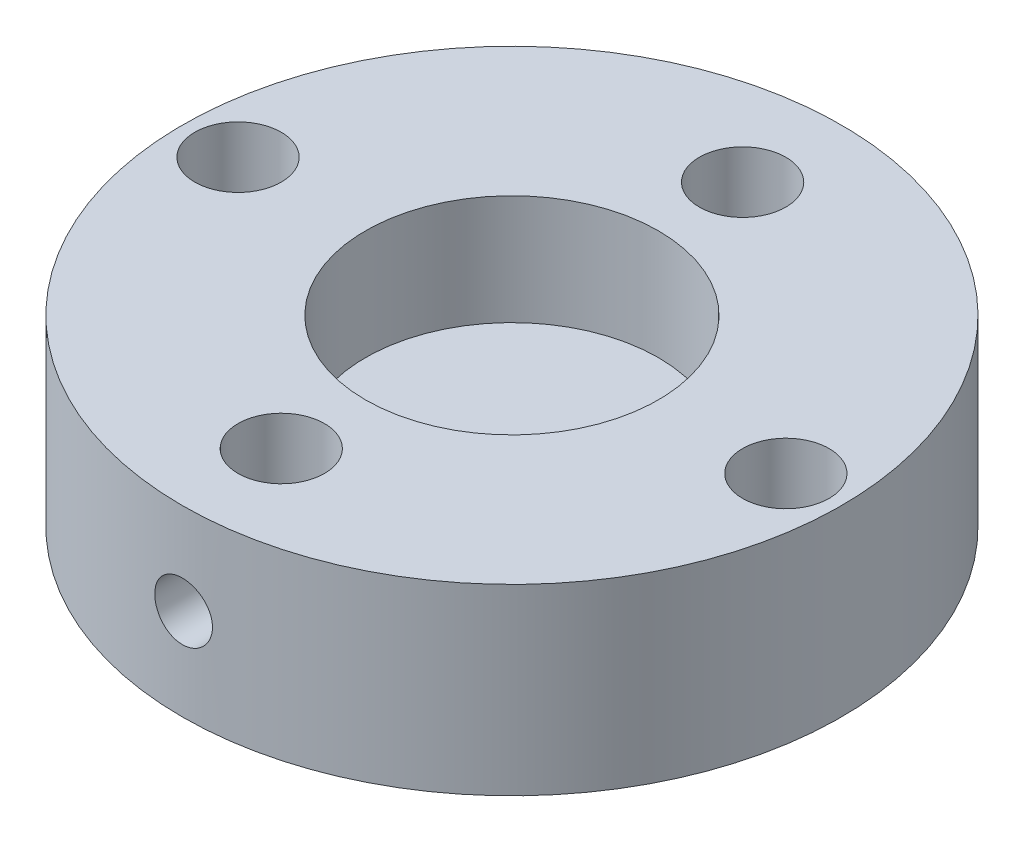
ISO-10303-21;
HEADER;
FILE_DESCRIPTION(('STEP AP214'),'2;1');
FILE_NAME('part.step','',(''),(''),'','','');
FILE_SCHEMA(('AUTOMOTIVE_DESIGN { 1 0 10303 214 1 1 1 1 }'));
ENDSEC;
DATA;
#1=APPLICATION_CONTEXT('core data for automotive mechanical design processes');
#2=APPLICATION_PROTOCOL_DEFINITION('international standard','automotive_design',2000,#1);
#3=PRODUCT_CONTEXT('',#1,'mechanical');
#4=PRODUCT('Part','Part','',(#3));
#5=PRODUCT_RELATED_PRODUCT_CATEGORY('part','',(#4));
#6=PRODUCT_DEFINITION_FORMATION('','',#4);
#7=PRODUCT_DEFINITION_CONTEXT('part definition',#1,'design');
#8=PRODUCT_DEFINITION('design','',#6,#7);
#9=PRODUCT_DEFINITION_SHAPE('','',#8);
#10=(LENGTH_UNIT() NAMED_UNIT(*) SI_UNIT(.MILLI.,.METRE.));
#11=(NAMED_UNIT(*) PLANE_ANGLE_UNIT() SI_UNIT($,.RADIAN.));
#12=(NAMED_UNIT(*) SI_UNIT($,.STERADIAN.) SOLID_ANGLE_UNIT());
#13=UNCERTAINTY_MEASURE_WITH_UNIT(LENGTH_MEASURE(1.E-05),#10,'distance_accuracy_value','');
#14=(GEOMETRIC_REPRESENTATION_CONTEXT(3) GLOBAL_UNCERTAINTY_ASSIGNED_CONTEXT((#13)) GLOBAL_UNIT_ASSIGNED_CONTEXT((#10,
#11,#12)) REPRESENTATION_CONTEXT('',''));
#15=CARTESIAN_POINT('',(0.,0.,0.));
#16=DIRECTION('',(0.,0.,1.));
#17=DIRECTION('',(1.,0.,0.));
#18=AXIS2_PLACEMENT_3D('',#15,#16,#17);
#19=CARTESIAN_POINT('',(0.,6.35,0.));
#20=DIRECTION('',(0.,-1.,0.));
#21=DIRECTION('',(0.,0.,-1.));
#22=AXIS2_PLACEMENT_3D('',#19,#20,#21);
#23=CYLINDRICAL_SURFACE('',#22,11.43);
#24=CARTESIAN_POINT('',(1.,3.175,11.3861714373182));
#25=CARTESIAN_POINT('',(0.999997555838026,3.11894500843291,11.3861720165734));
#26=CARTESIAN_POINT('',(0.995270896386772,3.0628521103578,11.3865898393277));
#27=CARTESIAN_POINT('',(0.976485350327271,2.95221906891785,11.3882159189293));
#28=CARTESIAN_POINT('',(0.962415956830822,2.89768074593707,11.3894250656817));
#29=CARTESIAN_POINT('',(0.92535561340541,2.79177515931459,11.3924958037464));
#30=CARTESIAN_POINT('',(0.902369802818164,2.74040608867789,11.3943570191527));
#31=CARTESIAN_POINT('',(0.848138425403111,2.64226721220982,11.3985217140138));
#32=CARTESIAN_POINT('',(0.816894595213187,2.5954964422029,11.4008251004536));
#33=CARTESIAN_POINT('',(0.746939179515819,2.50773816539562,11.4056218809279));
#34=CARTESIAN_POINT('',(0.708209129929394,2.46676540081199,11.4081157353402));
#35=CARTESIAN_POINT('',(0.624419857178876,2.3918929271586,11.4130082506768));
#36=CARTESIAN_POINT('',(0.579360354646559,2.35799353045608,11.4154069073931));
#37=CARTESIAN_POINT('',(0.484102656973631,2.29818049543833,11.4198431770178));
#38=CARTESIAN_POINT('',(0.433896371688904,2.2722796945228,11.4218802073271));
#39=CARTESIAN_POINT('',(0.329826648794757,2.22928119422985,11.4253587319567));
#40=CARTESIAN_POINT('',(0.275963281047933,2.21218332674027,11.4268002376499));
#41=CARTESIAN_POINT('',(0.16625575701746,2.1873187000481,11.4289220731964));
#42=CARTESIAN_POINT('',(0.110417068666835,2.17952798464206,11.429604356942));
#43=CARTESIAN_POINT('',(-0.00177924398146985,2.17342473923944,11.430137501248));
#44=CARTESIAN_POINT('',(-0.0581368577202864,2.1751120168125,11.4299883786884));
#45=CARTESIAN_POINT('',(-0.169608754882562,2.18789730406455,11.4288771214472));
#46=CARTESIAN_POINT('',(-0.224726018230913,2.19896955285521,11.427917212326));
#47=CARTESIAN_POINT('',(-0.332316809154457,2.23017040839638,11.4252948877021));
#48=CARTESIAN_POINT('',(-0.384790309400042,2.2502991087456,11.423632464939));
#49=CARTESIAN_POINT('',(-0.485685838763071,2.2990700902863,11.419788279077));
#50=CARTESIAN_POINT('',(-0.53410227871048,2.32772387664367,11.4176058149456));
#51=CARTESIAN_POINT('',(-0.625448323335066,2.39272330086099,11.412966722835));
#52=CARTESIAN_POINT('',(-0.668377805133158,2.42906911093354,11.4105100887182));
#53=CARTESIAN_POINT('',(-0.747682006089085,2.5085659766914,11.4055889348539));
#54=CARTESIAN_POINT('',(-0.784034284205354,2.55173942283603,11.40312441626));
#55=CARTESIAN_POINT('',(-0.848978711203027,2.64358808817524,11.3984735224765));
#56=CARTESIAN_POINT('',(-0.877570852696613,2.69226331260756,11.3962871475516));
#57=CARTESIAN_POINT('',(-0.926182699400104,2.79374992630512,11.3924397393145));
#58=CARTESIAN_POINT('',(-0.946201188515546,2.84656190107487,11.3907787805364));
#59=CARTESIAN_POINT('',(-0.977080599091123,2.95481512686844,11.3881717477558));
#60=CARTESIAN_POINT('',(-0.987941733057373,3.010256316847,11.387225657164));
#61=CARTESIAN_POINT('',(-1.00016961040494,3.12199768338941,11.3861582214213));
#62=CARTESIAN_POINT('',(-1.00156767148317,3.17829440795342,11.3860341558373));
#63=CARTESIAN_POINT('',(-0.994911802588876,3.29032139879284,11.3866176378213));
#64=CARTESIAN_POINT('',(-0.986857969935857,3.34605167089466,11.387325176827));
#65=CARTESIAN_POINT('',(-0.96155306264297,3.45527355077652,11.3894896675348));
#66=CARTESIAN_POINT('',(-0.944316648056771,3.50876858073464,11.3909454245716));
#67=CARTESIAN_POINT('',(-0.901150773376053,3.6121075418915,11.394441339764));
#68=CARTESIAN_POINT('',(-0.875221159819217,3.6619514086168,11.3964815082362));
#69=CARTESIAN_POINT('',(-0.815325871463008,3.75671633979027,11.400922965154));
#70=CARTESIAN_POINT('',(-0.78133935429241,3.8016241867347,11.4033251842162));
#71=CARTESIAN_POINT('',(-0.706325059451844,3.88510861831019,11.4082169511645));
#72=CARTESIAN_POINT('',(-0.665297148322542,3.92368508291204,11.4107065007051));
#73=CARTESIAN_POINT('',(-0.577229240080058,3.99351885952334,11.4155005466397));
#74=CARTESIAN_POINT('',(-0.530173060130384,4.02475580435066,11.4178045166883));
#75=CARTESIAN_POINT('',(-0.431464835370097,4.07888399844227,11.421960205372));
#76=CARTESIAN_POINT('',(-0.379812840510635,4.10177533839975,11.4238119289217));
#77=CARTESIAN_POINT('',(-0.273451738417607,4.1385276521858,11.4268520746027));
#78=CARTESIAN_POINT('',(-0.218746986937728,4.15240115240184,11.4280414164963));
#79=CARTESIAN_POINT('',(-0.107773679124563,4.17076489601897,11.4296265366183));
#80=CARTESIAN_POINT('',(-0.0515051557457677,4.17525533700431,11.4300223315569));
#81=CARTESIAN_POINT('',(0.0607978444524323,4.17472308302087,11.4299757804168));
#82=CARTESIAN_POINT('',(0.116832475450718,4.16973210029219,11.429536228297));
#83=CARTESIAN_POINT('',(0.227264346205335,4.15044489107848,11.4278738913439));
#84=CARTESIAN_POINT('',(0.28166158393109,4.13614865305424,11.4266511055393));
#85=CARTESIAN_POINT('',(0.387276035875597,4.09866498781539,11.4235594506122));
#86=CARTESIAN_POINT('',(0.438493484748339,4.07547821759005,11.4216906292313));
#87=CARTESIAN_POINT('',(0.536313999039591,4.02087523161488,11.4175158011809));
#88=CARTESIAN_POINT('',(0.582917126645287,3.98945912679256,11.4152098004045));
#89=CARTESIAN_POINT('',(0.670348501668957,3.91917017412494,11.410410132186));
#90=CARTESIAN_POINT('',(0.711157810745139,3.88027380849499,11.4079158883505));
#91=CARTESIAN_POINT('',(0.785685912597246,3.79617214511703,11.403025759686));
#92=CARTESIAN_POINT('',(0.819402989639507,3.75096532515119,11.4006298987701));
#93=CARTESIAN_POINT('',(0.878840174557921,3.65542956942002,11.3962025603864));
#94=CARTESIAN_POINT('',(0.904543939325216,3.60509044007583,11.394171831125));
#95=CARTESIAN_POINT('',(0.947101014090986,3.50082686918671,11.3907137508277));
#96=CARTESIAN_POINT('',(0.963964454751998,3.44690661169693,11.3892857095028));
#97=CARTESIAN_POINT('',(0.984088037137708,3.35639262056503,11.3875603077196));
#98=CARTESIAN_POINT('',(0.990047039870105,3.32038026111235,11.3870418914268));
#99=CARTESIAN_POINT('',(0.998003810348495,3.24791728112114,11.3863472683249));
#100=CARTESIAN_POINT('',(1.00000159005337,3.21146666190603,11.3861710604828));
#101=CARTESIAN_POINT('',(1.,3.175,11.3861714373182));
#102=B_SPLINE_CURVE_WITH_KNOTS('',3,(#24,#25,#26,#27,#28,#29,#30,#31,#32,#33,#34,#35,#36,#37,
#38,#39,#40,#41,#42,#43,#44,#45,#46,#47,#48,#49,#50,#51,#52,#53,#54,#55,#56,#57,#58,#59,#60,#61,
#62,#63,#64,#65,#66,#67,#68,#69,#70,#71,#72,#73,#74,#75,#76,#77,#78,#79,#80,#81,#82,#83,#84,#85,
#86,#87,#88,#89,#90,#91,#92,#93,#94,#95,#96,#97,#98,#99,#100,#101),.UNSPECIFIED.,.T.,.F.,(4,2,2,
2,2,2,2,2,2,2,2,2,2,2,2,2,2,2,2,2,2,2,2,2,2,2,2,2,2,2,2,2,2,2,2,2,2,2,4),(0.,0.168031822796117,
0.336252935828197,0.504377231470142,0.672466199146253,0.840975158534159,1.00949155787779,
1.17827702973876,1.34705927813527,1.51540614586025,1.68374959567464,1.85163244896713,
2.01951703737406,2.18762923285831,2.35574519251466,2.5244243605524,2.6931036891758,
2.86180693550756,3.03050626679425,3.19864701960454,3.36678604120278,3.53465742864373,
3.70253177969895,3.87084523657715,4.03916188394336,4.20794023494467,4.37671675174606,
4.54525832272236,4.71379634459001,4.88177165456527,5.04974717284276,5.21771028051883,
5.38567112424869,5.55416893127769,5.72270745408018,5.8915874950197,6.06027358069297,
6.16958727424942,6.27890063778863),.UNSPECIFIED.);
#103=CARTESIAN_POINT('',(1.,3.175,11.3861714373182));
#104=VERTEX_POINT('',#103);
#105=EDGE_CURVE('E75',#104,#104,#102,.T.);
#106=ORIENTED_EDGE('',*,*,#105,.T.);
#107=EDGE_LOOP('',(#106));
#108=FACE_BOUND('',#107,.T.);
#109=CARTESIAN_POINT('',(0.,6.35,0.));
#110=DIRECTION('',(0.,1.,0.));
#111=DIRECTION('',(0.,0.,1.));
#112=AXIS2_PLACEMENT_3D('',#109,#110,#111);
#113=CIRCLE('',#112,11.43);
#114=CARTESIAN_POINT('',(0.,6.35,11.43));
#115=VERTEX_POINT('',#114);
#116=EDGE_CURVE('E11',#115,#115,#113,.T.);
#117=ORIENTED_EDGE('',*,*,#116,.F.);
#118=EDGE_LOOP('',(#117));
#119=FACE_BOUND('',#118,.T.);
#120=CARTESIAN_POINT('',(0.,0.,0.));
#121=DIRECTION('',(0.,1.,0.));
#122=DIRECTION('',(0.,0.,1.));
#123=AXIS2_PLACEMENT_3D('',#120,#121,#122);
#124=CIRCLE('',#123,11.43);
#125=CARTESIAN_POINT('',(0.,0.,11.43));
#126=VERTEX_POINT('',#125);
#127=EDGE_CURVE('E56',#126,#126,#124,.T.);
#128=ORIENTED_EDGE('',*,*,#127,.T.);
#129=EDGE_LOOP('',(#128));
#130=FACE_BOUND('',#129,.T.);
#131=CARTESIAN_POINT('',(0.,4.175,-11.43));
#132=CARTESIAN_POINT('',(0.056055454507377,4.1749975562544,-11.4299994289336));
#133=CARTESIAN_POINT('',(0.112148814029586,4.17027082137,-11.4295832432781));
#134=CARTESIAN_POINT('',(0.222782814251352,4.15148494844001,-11.4279630122635));
#135=CARTESIAN_POINT('',(0.277321634928974,4.13741530509721,-11.4267580800485));
#136=CARTESIAN_POINT('',(0.383228273839128,4.10035423076208,-11.42369648476));
#137=CARTESIAN_POINT('',(0.434597894852015,4.07736792721999,-11.4218401963019));
#138=CARTESIAN_POINT('',(0.532737693125505,4.023135389006,-11.4176839199935));
#139=CARTESIAN_POINT('',(0.579508835250971,3.99189089218609,-11.415384025523));
#140=CARTESIAN_POINT('',(0.667266690300017,3.92193480374708,-11.410591327515));
#141=CARTESIAN_POINT('',(0.708238779245109,3.88320489691913,-11.4080980599817));
#142=CARTESIAN_POINT('',(0.783109949355203,3.79941619315679,-11.4032035024789));
#143=CARTESIAN_POINT('',(0.817008716081256,3.75435711501302,-11.4008022166023));
#144=CARTESIAN_POINT('',(0.876821093556905,3.65909978762241,-11.3963585844583));
#145=CARTESIAN_POINT('',(0.902721750864794,3.60889337526397,-11.3943168227372));
#146=CARTESIAN_POINT('',(0.945719950579971,3.50482337613384,-11.3908288489527));
#147=CARTESIAN_POINT('',(0.962817662811561,3.45095985993681,-11.3893826254003));
#148=CARTESIAN_POINT('',(0.987681963262137,3.34125188775861,-11.3872534563654));
#149=CARTESIAN_POINT('',(0.995472494724918,3.28541289692441,-11.3865685526625));
#150=CARTESIAN_POINT('',(1.0015752674454,3.17321599248953,-11.3860334120111));
#151=CARTESIAN_POINT('',(0.999887703110116,3.11685808955602,-11.386183157943));
#152=CARTESIAN_POINT('',(0.98710196323395,3.00538746078274,-11.3872986152041));
#153=CARTESIAN_POINT('',(0.976029837204374,2.95027172128501,-11.3882620678333));
#154=CARTESIAN_POINT('',(0.944829755934749,2.84268391472994,-11.3908928424799));
#155=CARTESIAN_POINT('',(0.924701704332572,2.79021187581026,-11.3925601719872));
#156=CARTESIAN_POINT('',(0.875932063206309,2.68931811248898,-11.3964134343004));
#157=CARTESIAN_POINT('',(0.847278816677999,2.64090205099207,-11.3986000763618));
#158=CARTESIAN_POINT('',(0.782280543088762,2.54955653404974,-11.4032449431901));
#159=CARTESIAN_POINT('',(0.745935344107743,2.50662720127065,-11.4057031740265));
#160=CARTESIAN_POINT('',(0.666438910069543,2.42732230486281,-11.4106242902822));
#161=CARTESIAN_POINT('',(0.623265160230089,2.39096930581197,-11.4130871634854));
#162=CARTESIAN_POINT('',(0.531415631030415,2.32602356919006,-11.4177321882536));
#163=CARTESIAN_POINT('',(0.482739847480339,2.29743083752857,-11.4199143396048));
#164=CARTESIAN_POINT('',(0.381253086011759,2.24881856693497,-11.4237525335175));
#165=CARTESIAN_POINT('',(0.328441610649426,2.22880006119581,-11.425408512669));
#166=CARTESIAN_POINT('',(0.220189469829012,2.1979204641722,-11.4280070731471));
#167=CARTESIAN_POINT('',(0.164748864550757,2.18705916338944,-11.4289496707943));
#168=CARTESIAN_POINT('',(0.0530077641280889,2.17483065738645,-11.4300131685161));
#169=CARTESIAN_POINT('',(-0.00328929635966897,2.17343229166084,-11.4301367654506));
#170=CARTESIAN_POINT('',(-0.115317032366279,2.18008767117695,-11.4295555452258));
#171=CARTESIAN_POINT('',(-0.171047713710849,2.18814131909676,-11.4288507365962));
#172=CARTESIAN_POINT('',(-0.280271599469384,2.21344627975344,-11.4266936865659));
#173=CARTESIAN_POINT('',(-0.333768183221313,2.23068311499961,-11.4252426217786));
#174=CARTESIAN_POINT('',(-0.437110065703555,2.27385035175211,-11.4217560153752));
#175=CARTESIAN_POINT('',(-0.486955301000822,2.2997809042464,-11.4197204636082));
#176=CARTESIAN_POINT('',(-0.581721155765354,2.35967756957545,-11.4152862292509));
#177=CARTESIAN_POINT('',(-0.626628708701811,2.39366428612465,-11.4128866213435));
#178=CARTESIAN_POINT('',(-0.710112454118576,2.46867881000742,-11.4079968643066));
#179=CARTESIAN_POINT('',(-0.748688525290946,2.50970675221647,-11.4055067134435));
#180=CARTESIAN_POINT('',(-0.818521464406575,2.59777448686002,-11.4007085113035));
#181=CARTESIAN_POINT('',(-0.849757970894856,2.6448304569788,-11.3984009781222));
#182=CARTESIAN_POINT('',(-0.903885395651283,2.74353814639829,-11.3942367574829));
#183=CARTESIAN_POINT('',(-0.926776404513475,2.79518981580311,-11.3923800651309));
#184=CARTESIAN_POINT('',(-0.963528496551529,2.90155113361215,-11.3893307436515));
#185=CARTESIAN_POINT('',(-0.977401962697089,2.95625647603681,-11.3881372042052));
#186=CARTESIAN_POINT('',(-0.99576543788786,3.06723102914043,-11.3865463372818));
#187=CARTESIAN_POINT('',(-1.00025564766649,3.1235002063386,-11.3861489927719));
#188=CARTESIAN_POINT('',(-0.999722724546685,3.2358027996207,-11.3861957813583));
#189=CARTESIAN_POINT('',(-0.994731581841759,3.29183637146005,-11.3866370848485));
#190=CARTESIAN_POINT('',(-0.975444425515668,3.40226608426113,-11.3883054289028));
#191=CARTESIAN_POINT('',(-0.961148398476352,3.45666222286147,-11.3895324706001));
#192=CARTESIAN_POINT('',(-0.923665564029778,3.56227449069432,-11.3926332808625));
#193=CARTESIAN_POINT('',(-0.900479420892788,3.61349085718754,-11.3945070011068));
#194=CARTESIAN_POINT('',(-0.84587802375866,3.7113094687815,-11.3986901348937));
#195=CARTESIAN_POINT('',(-0.814462879496348,3.75791177539992,-11.4009995426263));
#196=CARTESIAN_POINT('',(-0.744174977431894,3.84534321235715,-11.4058031272211));
#197=CARTESIAN_POINT('',(-0.705278482564768,3.886153228627,-11.4082978762488));
#198=CARTESIAN_POINT('',(-0.621176270551096,3.9606826968835,-11.4131858131646));
#199=CARTESIAN_POINT('',(-0.575969032758612,3.99440043498085,-11.4155789763927));
#200=CARTESIAN_POINT('',(-0.480432942505038,4.05383832457257,-11.4199988544701));
#201=CARTESIAN_POINT('',(-0.430093971430901,4.0795422534836,-11.4220248225711));
#202=CARTESIAN_POINT('',(-0.325830737447029,4.12209967908748,-11.4254734619445));
#203=CARTESIAN_POINT('',(-0.271910657601826,4.13896330411959,-11.4268968232623));
#204=CARTESIAN_POINT('',(-0.181396172396869,4.15908741051904,-11.4286162724851));
#205=CARTESIAN_POINT('',(-0.145383104159998,4.16504664903346,-11.4291327947681));
#206=CARTESIAN_POINT('',(-0.0729187038847792,4.17300373277392,-11.4298248437738));
#207=CARTESIAN_POINT('',(-0.0364673731522813,4.17500158980038,-11.4300003715123));
#208=CARTESIAN_POINT('',(0.,4.175,-11.43));
#209=B_SPLINE_CURVE_WITH_KNOTS('',3,(#131,#132,#133,#134,#135,#136,#137,#138,#139,#140,#141,
#142,#143,#144,#145,#146,#147,#148,#149,#150,#151,#152,#153,#154,#155,#156,#157,#158,#159,#160,
#161,#162,#163,#164,#165,#166,#167,#168,#169,#170,#171,#172,#173,#174,#175,#176,#177,#178,#179,
#180,#181,#182,#183,#184,#185,#186,#187,#188,#189,#190,#191,#192,#193,#194,#195,#196,#197,#198,
#199,#200,#201,#202,#203,#204,#205,#206,#207,#208),.UNSPECIFIED.,.T.,.F.,(4,2,2,2,2,2,2,2,2,2,2,
2,2,2,2,2,2,2,2,2,2,2,2,2,2,2,2,2,2,2,2,2,2,2,2,2,2,2,4),(0.,0.168033213288184,
0.336255686127267,0.504381567110338,0.672472095858371,0.840979235790305,1.00949386497881,
1.17827999990742,1.34706287853241,1.51541061227275,1.68375489301341,1.85163341106457,
2.01951371551668,2.18762463594924,2.35573931416607,2.52442031361029,2.6931014415077,
2.86180288974134,3.03050047832245,3.19864229102974,3.36678237249365,3.53465815854037,
3.70253686031765,3.87084963614682,4.03916563638599,4.20794320744327,4.37671894629126,
4.54526242839272,4.71380230485291,4.8817745356371,5.04974700864697,5.21770693318379,
5.38566461806668,5.55416426740837,5.72270458898488,5.8915839089332,6.06026931857086,
6.16958514159968,6.27890063899076),.UNSPECIFIED.);
#210=CARTESIAN_POINT('',(0.,4.175,-11.43));
#211=VERTEX_POINT('',#210);
#212=EDGE_CURVE('E76',#211,#211,#209,.T.);
#213=ORIENTED_EDGE('',*,*,#212,.F.);
#214=EDGE_LOOP('',(#213));
#215=FACE_BOUND('',#214,.T.);
#216=ADVANCED_FACE('F42',(#108,#119,#130,#215),#23,.T.);
#217=CARTESIAN_POINT('',(0.,0.,-8.));
#218=DIRECTION('',(0.,1.,0.));
#219=DIRECTION('',(0.,0.,1.));
#220=AXIS2_PLACEMENT_3D('',#217,#218,#219);
#221=CYLINDRICAL_SURFACE('',#220,1.5);
#222=CARTESIAN_POINT('',(0.,0.,-8.));
#223=DIRECTION('',(0.,1.,0.));
#224=DIRECTION('',(0.,0.,1.));
#225=AXIS2_PLACEMENT_3D('',#222,#223,#224);
#226=CIRCLE('',#225,1.5);
#227=CARTESIAN_POINT('',(0.,0.,-6.5));
#228=VERTEX_POINT('',#227);
#229=EDGE_CURVE('E109',#228,#228,#226,.T.);
#230=ORIENTED_EDGE('',*,*,#229,.F.);
#231=EDGE_LOOP('',(#230));
#232=FACE_BOUND('',#231,.T.);
#233=CARTESIAN_POINT('',(0.,6.35,-8.));
#234=DIRECTION('',(0.,1.,0.));
#235=DIRECTION('',(0.,0.,1.));
#236=AXIS2_PLACEMENT_3D('',#233,#234,#235);
#237=CIRCLE('',#236,1.5);
#238=CARTESIAN_POINT('',(0.,6.35,-6.5));
#239=VERTEX_POINT('',#238);
#240=EDGE_CURVE('E113',#239,#239,#237,.T.);
#241=ORIENTED_EDGE('',*,*,#240,.T.);
#242=EDGE_LOOP('',(#241));
#243=FACE_BOUND('',#242,.T.);
#244=CARTESIAN_POINT('',(-1.,3.175,-9.11803398874989));
#245=CARTESIAN_POINT('',(-0.999997269988655,3.12618584456569,-9.11803876731408));
#246=CARTESIAN_POINT('',(-0.99639496251832,3.0773546231456,-9.12129035523721));
#247=CARTESIAN_POINT('',(-0.982291341588655,2.98144004417459,-9.13365986250808));
#248=CARTESIAN_POINT('',(-0.971777652939311,2.93435998223522,-9.14278830406355));
#249=CARTESIAN_POINT('',(-0.94467930838316,2.84363227906116,-9.16528292912785));
#250=CARTESIAN_POINT('',(-0.92815359007107,2.79995615163117,-9.17860780897301));
#251=CARTESIAN_POINT('',(-0.889670041967692,2.71606708382667,-9.20792047340913));
#252=CARTESIAN_POINT('',(-0.867711084060814,2.67585486501176,-9.22390881079415));
#253=CARTESIAN_POINT('',(-0.815012050038568,2.59317655619155,-9.25973036466013));
#254=CARTESIAN_POINT('',(-0.783437177258661,2.5513339411414,-9.27977468045182));
#255=CARTESIAN_POINT('',(-0.714096098703399,2.47299864556286,-9.31972413654041));
#256=CARTESIAN_POINT('',(-0.6763238658854,2.43651123917074,-9.33962912148992));
#257=CARTESIAN_POINT('',(-0.589078452471477,2.36467817060917,-9.38044409261873));
#258=CARTESIAN_POINT('',(-0.538703219829095,2.33025874411216,-9.40108392923461));
#259=CARTESIAN_POINT('',(-0.431235482106116,2.27067895225496,-9.43779242241382));
#260=CARTESIAN_POINT('',(-0.374150576160852,2.24550824298441,-9.45386618115518));
#261=CARTESIAN_POINT('',(-0.261624536740002,2.20822179949127,-9.47799953732363));
#262=CARTESIAN_POINT('',(-0.206717362590708,2.19495832775222,-9.48675587807933));
#263=CARTESIAN_POINT('',(-0.0948477243649312,2.17790775535818,-9.49804872730961));
#264=CARTESIAN_POINT('',(-0.0378879406429128,2.17410872038728,-9.50059306881179));
#265=CARTESIAN_POINT('',(0.0670735251161643,2.17608622497453,-9.49927680861477));
#266=CARTESIAN_POINT('',(0.115120319004376,2.18049452565853,-9.49633132455064));
#267=CARTESIAN_POINT('',(0.209619316635507,2.19604552567945,-9.4860409139501));
#268=CARTESIAN_POINT('',(0.256071403824862,2.20718871615177,-9.47869566656551));
#269=CARTESIAN_POINT('',(0.346038968835584,2.23559784239729,-9.46026045851868));
#270=CARTESIAN_POINT('',(0.38956531192298,2.25283944259928,-9.44918538991339));
#271=CARTESIAN_POINT('',(0.473104575326778,2.29277682147641,-9.42410552238144));
#272=CARTESIAN_POINT('',(0.513116852484701,2.31547359575076,-9.41010018872581));
#273=CARTESIAN_POINT('',(0.59414214598172,2.36898936872995,-9.37809029225351));
#274=CARTESIAN_POINT('',(0.634595740498539,2.40048376167639,-9.35980204396013));
#275=CARTESIAN_POINT('',(0.709994037491523,2.46894933974016,-9.32200300913499));
#276=CARTESIAN_POINT('',(0.744930067597284,2.50592897296691,-9.30249036407615));
#277=CARTESIAN_POINT('',(0.813861176630826,2.59098160510664,-9.26075022472076));
#278=CARTESIAN_POINT('',(0.846867965631776,2.63988553985724,-9.23857160004468));
#279=CARTESIAN_POINT('',(0.904174374727408,2.74375491961036,-9.19737805415546));
#280=CARTESIAN_POINT('',(0.92848859327447,2.79870999720697,-9.17835785767438));
#281=CARTESIAN_POINT('',(0.961663622838891,2.89735953103654,-9.15131435153449));
#282=CARTESIAN_POINT('',(0.972953958737704,2.93979668502839,-9.1417018228885));
#283=CARTESIAN_POINT('',(0.98989777790003,3.02651974490846,-9.1270451989479));
#284=CARTESIAN_POINT('',(0.995561034821825,3.07080230558646,-9.12199318391118));
#285=CARTESIAN_POINT('',(1.00089700074453,3.16022149322059,-9.11723778493745));
#286=CARTESIAN_POINT('',(1.00054364876605,3.20536098925948,-9.11755766933454));
#287=CARTESIAN_POINT('',(0.993808148581262,3.2948419169781,-9.12354940184257));
#288=CARTESIAN_POINT('',(0.987421113449806,3.33918267205586,-9.12922558823607));
#289=CARTESIAN_POINT('',(0.969499055937226,3.42369470877286,-9.14463988751152));
#290=CARTESIAN_POINT('',(0.958230872657146,3.46396385449378,-9.15416593537715));
#291=CARTESIAN_POINT('',(0.931115208135282,3.54206311803266,-9.17614979263984));
#292=CARTESIAN_POINT('',(0.915266188999618,3.5798924115095,-9.18860858636727));
#293=CARTESIAN_POINT('',(0.875816733031263,3.66010100188837,-9.21805741810736));
#294=CARTESIAN_POINT('',(0.851300144226031,3.70187840563095,-9.23545540768822));
#295=CARTESIAN_POINT('',(0.79676365764559,3.78120840116497,-9.27131257456476));
#296=CARTESIAN_POINT('',(0.766737059459379,3.81875575832942,-9.2897730248931));
#297=CARTESIAN_POINT('',(0.694383288512648,3.89698117378524,-9.33037839141598));
#298=CARTESIAN_POINT('',(0.650801932557862,3.93655142413785,-9.35244726064259));
#299=CARTESIAN_POINT('',(0.556549744344254,4.00790834145647,-9.39387790925842));
#300=CARTESIAN_POINT('',(0.505885238731676,4.03970188562506,-9.41324207395941));
#301=CARTESIAN_POINT('',(0.408743737408331,4.08894586946146,-9.44395410620131));
#302=CARTESIAN_POINT('',(0.363331182442472,4.1079782522209,-9.45612729055242));
#303=CARTESIAN_POINT('',(0.269378539510943,4.13930359715951,-9.47639353933782));
#304=CARTESIAN_POINT('',(0.220841131929568,4.15160225142969,-9.48449004936067));
#305=CARTESIAN_POINT('',(0.121684696151535,4.16884848191957,-9.49589182013302));
#306=CARTESIAN_POINT('',(0.0710574184621087,4.17376333975339,-9.49917575428247));
#307=CARTESIAN_POINT('',(-0.0304277732903172,4.1758239257085,-9.50054910514547));
#308=CARTESIAN_POINT('',(-0.0812856654767117,4.17297037597807,-9.49863900469455));
#309=CARTESIAN_POINT('',(-0.177878766264065,4.16017025549766,-9.49014777988657));
#310=CARTESIAN_POINT('',(-0.223717571535269,4.1507545075691,-9.48391638604927));
#311=CARTESIAN_POINT('',(-0.313009211498528,4.12588099528455,-9.46768053103468));
#312=CARTESIAN_POINT('',(-0.356461674343445,4.11042229232637,-9.45767548373552));
#313=CARTESIAN_POINT('',(-0.442573648304177,4.07303064755799,-9.43395882743097));
#314=CARTESIAN_POINT('',(-0.485041794600133,4.05077484625246,-9.42006624473169));
#315=CARTESIAN_POINT('',(-0.565776331341592,4.00092467768701,-9.38987704117736));
#316=CARTESIAN_POINT('',(-0.60404018602501,3.973327116024,-9.37357898322632));
#317=CARTESIAN_POINT('',(-0.681647111007011,3.90868554883184,-9.33696465736197));
#318=CARTESIAN_POINT('',(-0.720213397630457,3.87083848816298,-9.31641956938685));
#319=CARTESIAN_POINT('',(-0.790800111407979,3.78944322922708,-9.27526678824743));
#320=CARTESIAN_POINT('',(-0.822815641619616,3.74589080558295,-9.25465905985077));
#321=CARTESIAN_POINT('',(-0.877566267592056,3.65706620462235,-9.21692106795149));
#322=CARTESIAN_POINT('',(-0.900823234486051,3.61217909502483,-9.19964543370952));
#323=CARTESIAN_POINT('',(-0.940579011701362,3.51835777550342,-9.16873750795511));
#324=CARTESIAN_POINT('',(-0.957090951406666,3.46943165306892,-9.15509815647652));
#325=CARTESIAN_POINT('',(-0.97968131235454,3.37961426578772,-9.1359552596477));
#326=CARTESIAN_POINT('',(-0.987261141866242,3.33934588160485,-9.12931847705076));
#327=CARTESIAN_POINT('',(-0.997419579094631,3.25772179974773,-9.12035759608004));
#328=CARTESIAN_POINT('',(-1.00000231351858,3.21636702786971,-9.11802993920738));
#329=CARTESIAN_POINT('',(-1.,3.175,-9.11803398874989));
#330=B_SPLINE_CURVE_WITH_KNOTS('',3,(#244,#245,#246,#247,#248,#249,#250,#251,#252,#253,#254,
#255,#256,#257,#258,#259,#260,#261,#262,#263,#264,#265,#266,#267,#268,#269,#270,#271,#272,#273,
#274,#275,#276,#277,#278,#279,#280,#281,#282,#283,#284,#285,#286,#287,#288,#289,#290,#291,#292,
#293,#294,#295,#296,#297,#298,#299,#300,#301,#302,#303,#304,#305,#306,#307,#308,#309,#310,#311,
#312,#313,#314,#315,#316,#317,#318,#319,#320,#321,#322,#323,#324,#325,#326,#327,#328,#329),
.UNSPECIFIED.,.T.,.F.,(4,2,2,2,2,2,2,2,2,2,2,2,2,2,2,2,2,2,2,2,2,2,2,2,2,2,2,2,2,2,2,2,2,2,2,2,
2,2,2,2,2,2,4),(0.,0.146253465361076,0.292769521129644,0.437886325608137,0.583033286332744,
0.750773385343188,0.918677592181377,1.11083515503145,1.3027771469429,1.4731874103179,
1.64338268344149,1.78769767477871,1.93202319141873,2.07577915986595,2.219561384515,
2.38223762973317,2.54516707398319,2.73339351752472,2.92130234871974,3.05563045200662,
3.18972483117743,3.32440018819018,3.45918471785299,3.58738225853468,3.71562288822479,
3.86949615025543,4.0235577839993,4.21127342259657,4.39882245285466,4.55035290305025,
4.70175506443411,4.85382614632258,5.00588309222248,5.1468839112404,5.28790663945594,
5.43708931492125,5.58636147964719,5.75911103141433,5.93198925208477,6.09167062897535,
6.25103968323788,6.37508308151303,6.49902399831892),.UNSPECIFIED.);
#331=CARTESIAN_POINT('',(-1.,3.175,-9.11803398874989));
#332=VERTEX_POINT('',#331);
#333=EDGE_CURVE('E46',#332,#332,#330,.T.);
#334=ORIENTED_EDGE('',*,*,#333,.F.);
#335=EDGE_LOOP('',(#334));
#336=FACE_BOUND('',#335,.T.);
#337=ADVANCED_FACE('F138',(#232,#243,#336),#221,.F.);
#338=CARTESIAN_POINT('',(0.,6.35,0.));
#339=DIRECTION('',(0.,1.,0.));
#340=DIRECTION('',(0.,0.,1.));
#341=AXIS2_PLACEMENT_3D('',#338,#339,#340);
#342=PLANE('',#341);
#343=CARTESIAN_POINT('',(0.,6.35,0.));
#344=DIRECTION('',(0.,1.,0.));
#345=DIRECTION('',(0.,0.,1.));
#346=AXIS2_PLACEMENT_3D('',#343,#344,#345);
#347=CIRCLE('',#346,5.08);
#348=CARTESIAN_POINT('',(0.,6.35,5.08));
#349=VERTEX_POINT('',#348);
#350=EDGE_CURVE('E171',#349,#349,#347,.T.);
#351=ORIENTED_EDGE('',*,*,#350,.F.);
#352=EDGE_LOOP('',(#351));
#353=FACE_BOUND('',#352,.T.);
#354=CARTESIAN_POINT('',(-9.5,6.35,0.));
#355=DIRECTION('',(0.,1.,0.));
#356=DIRECTION('',(0.,0.,1.));
#357=AXIS2_PLACEMENT_3D('',#354,#355,#356);
#358=CIRCLE('',#357,1.5);
#359=CARTESIAN_POINT('',(-9.5,6.35,1.5));
#360=VERTEX_POINT('',#359);
#361=EDGE_CURVE('E105',#360,#360,#358,.T.);
#362=ORIENTED_EDGE('',*,*,#361,.F.);
#363=EDGE_LOOP('',(#362));
#364=FACE_BOUND('',#363,.T.);
#365=ORIENTED_EDGE('',*,*,#240,.F.);
#366=EDGE_LOOP('',(#365));
#367=FACE_BOUND('',#366,.T.);
#368=CARTESIAN_POINT('',(0.,6.35,8.));
#369=DIRECTION('',(0.,1.,0.));
#370=DIRECTION('',(0.,0.,1.));
#371=AXIS2_PLACEMENT_3D('',#368,#369,#370);
#372=CIRCLE('',#371,1.5);
#373=CARTESIAN_POINT('',(0.,6.35,9.5));
#374=VERTEX_POINT('',#373);
#375=EDGE_CURVE('E121',#374,#374,#372,.T.);
#376=ORIENTED_EDGE('',*,*,#375,.F.);
#377=EDGE_LOOP('',(#376));
#378=FACE_BOUND('',#377,.T.);
#379=CARTESIAN_POINT('',(9.5,6.35,0.));
#380=DIRECTION('',(0.,1.,0.));
#381=DIRECTION('',(0.,0.,1.));
#382=AXIS2_PLACEMENT_3D('',#379,#380,#381);
#383=CIRCLE('',#382,1.5);
#384=CARTESIAN_POINT('',(9.5,6.35,1.5));
#385=VERTEX_POINT('',#384);
#386=EDGE_CURVE('E65',#385,#385,#383,.T.);
#387=ORIENTED_EDGE('',*,*,#386,.F.);
#388=EDGE_LOOP('',(#387));
#389=FACE_BOUND('',#388,.T.);
#390=ORIENTED_EDGE('',*,*,#116,.T.);
#391=EDGE_LOOP('',(#390));
#392=FACE_BOUND('',#391,.T.);
#393=ADVANCED_FACE('F135',(#353,#364,#367,#378,#389,#392),#342,.T.);
#394=CARTESIAN_POINT('',(0.,0.,0.));
#395=DIRECTION('',(0.,1.,0.));
#396=DIRECTION('',(0.,0.,1.));
#397=AXIS2_PLACEMENT_3D('',#394,#395,#396);
#398=PLANE('',#397);
#399=CARTESIAN_POINT('',(-9.5,0.,0.));
#400=DIRECTION('',(0.,1.,0.));
#401=DIRECTION('',(0.,0.,1.));
#402=AXIS2_PLACEMENT_3D('',#399,#400,#401);
#403=CIRCLE('',#402,1.5);
#404=CARTESIAN_POINT('',(-9.5,0.,1.5));
#405=VERTEX_POINT('',#404);
#406=EDGE_CURVE('E62',#405,#405,#403,.T.);
#407=ORIENTED_EDGE('',*,*,#406,.T.);
#408=EDGE_LOOP('',(#407));
#409=FACE_BOUND('',#408,.T.);
#410=ORIENTED_EDGE('',*,*,#229,.T.);
#411=EDGE_LOOP('',(#410));
#412=FACE_BOUND('',#411,.T.);
#413=CARTESIAN_POINT('',(0.,0.,8.));
#414=DIRECTION('',(0.,1.,0.));
#415=DIRECTION('',(0.,0.,1.));
#416=AXIS2_PLACEMENT_3D('',#413,#414,#415);
#417=CIRCLE('',#416,1.5);
#418=CARTESIAN_POINT('',(0.,0.,9.5));
#419=VERTEX_POINT('',#418);
#420=EDGE_CURVE('E117',#419,#419,#417,.T.);
#421=ORIENTED_EDGE('',*,*,#420,.T.);
#422=EDGE_LOOP('',(#421));
#423=FACE_BOUND('',#422,.T.);
#424=CARTESIAN_POINT('',(9.5,0.,0.));
#425=DIRECTION('',(0.,1.,0.));
#426=DIRECTION('',(0.,0.,1.));
#427=AXIS2_PLACEMENT_3D('',#424,#425,#426);
#428=CIRCLE('',#427,1.5);
#429=CARTESIAN_POINT('',(9.5,0.,1.5));
#430=VERTEX_POINT('',#429);
#431=EDGE_CURVE('E124',#430,#430,#428,.T.);
#432=ORIENTED_EDGE('',*,*,#431,.T.);
#433=EDGE_LOOP('',(#432));
#434=FACE_BOUND('',#433,.T.);
#435=ORIENTED_EDGE('',*,*,#127,.F.);
#436=EDGE_LOOP('',(#435));
#437=FACE_BOUND('',#436,.T.);
#438=ADVANCED_FACE('F137',(#409,#412,#423,#434,#437),#398,.F.);
#439=CARTESIAN_POINT('',(9.5,0.,0.));
#440=DIRECTION('',(0.,1.,0.));
#441=DIRECTION('',(0.,0.,1.));
#442=AXIS2_PLACEMENT_3D('',#439,#440,#441);
#443=CYLINDRICAL_SURFACE('',#442,1.5);
#444=ORIENTED_EDGE('',*,*,#431,.F.);
#445=EDGE_LOOP('',(#444));
#446=FACE_BOUND('',#445,.T.);
#447=ORIENTED_EDGE('',*,*,#386,.T.);
#448=EDGE_LOOP('',(#447));
#449=FACE_BOUND('',#448,.T.);
#450=ADVANCED_FACE('F133',(#446,#449),#443,.F.);
#451=CARTESIAN_POINT('',(0.,0.,8.));
#452=DIRECTION('',(0.,1.,0.));
#453=DIRECTION('',(0.,0.,1.));
#454=AXIS2_PLACEMENT_3D('',#451,#452,#453);
#455=CYLINDRICAL_SURFACE('',#454,1.5);
#456=CARTESIAN_POINT('',(0.,2.175,9.5));
#457=CARTESIAN_POINT('',(0.0502423583340641,2.17499972518375,9.50000020822414));
#458=CARTESIAN_POINT('',(0.100484543566458,2.17880698497775,9.49745401376693));
#459=CARTESIAN_POINT('',(0.199366529015834,2.19379843205283,9.48752326211906));
#460=CARTESIAN_POINT('',(0.248005556977502,2.20498612156165,9.48013640790618));
#461=CARTESIAN_POINT('',(0.342106153927126,2.23405385866242,9.46125241202354));
#462=CARTESIAN_POINT('',(0.387581436328778,2.25190257000397,9.44977452746657));
#463=CARTESIAN_POINT('',(0.474707645498629,2.29353168163575,9.4236306893872));
#464=CARTESIAN_POINT('',(0.516358015804834,2.31731294315028,9.40896427302755));
#465=CARTESIAN_POINT('',(0.598642350385055,2.37232846868372,9.37613664684919));
#466=CARTESIAN_POINT('',(0.638890152730338,2.40402393037145,9.3577844878966));
#467=CARTESIAN_POINT('',(0.713864022346369,2.47286502432922,9.31991156541733));
#468=CARTESIAN_POINT('',(0.748582027719439,2.51001846491887,9.30038915178416));
#469=CARTESIAN_POINT('',(0.81711148872748,2.59552618380634,9.25864132339397));
#470=CARTESIAN_POINT('',(0.849915931813755,2.64472282660172,9.236475339689));
#471=CARTESIAN_POINT('',(0.906751785070868,2.74918168882327,9.19542073676408));
#472=CARTESIAN_POINT('',(0.930798367132494,2.80443320078139,9.17652647977327));
#473=CARTESIAN_POINT('',(0.963370175057203,2.9033556467108,9.14988133320735));
#474=CARTESIAN_POINT('',(0.974372236180082,2.94576422643691,9.14048813946218));
#475=CARTESIAN_POINT('',(0.9907530889261,3.03237225237087,9.12628984829786));
#476=CARTESIAN_POINT('',(0.99614157325966,3.07656847436319,9.12147684372013));
#477=CARTESIAN_POINT('',(1.00095682070629,3.16573738942807,9.11718302804083));
#478=CARTESIAN_POINT('',(1.0003592145882,3.2107125117256,9.11772401279478));
#479=CARTESIAN_POINT('',(0.993187906666195,3.29981748675048,9.12409887741485));
#480=CARTESIAN_POINT('',(0.986609141899784,3.34394659101631,9.12993724142592));
#481=CARTESIAN_POINT('',(0.968324971088712,3.42823352561879,9.14563592995791));
#482=CARTESIAN_POINT('',(0.956858557405004,3.46848066796152,9.15530744165153));
#483=CARTESIAN_POINT('',(0.929350592909502,3.54651184549575,9.17754811463845));
#484=CARTESIAN_POINT('',(0.913307536614355,3.58429506514863,9.19011822916388));
#485=CARTESIAN_POINT('',(0.873369093698319,3.66451269764114,9.21982098202212));
#486=CARTESIAN_POINT('',(0.848540261643843,3.70632995009406,9.23736158924507));
#487=CARTESIAN_POINT('',(0.79334480233653,3.7856916974919,9.27345768922483));
#488=CARTESIAN_POINT('',(0.762971345040338,3.82323082883713,9.29201441370946));
#489=CARTESIAN_POINT('',(0.689905826559711,3.90127127285557,9.33271671862095));
#490=CARTESIAN_POINT('',(0.645969691404499,3.9406670243557,9.35477372355024));
#491=CARTESIAN_POINT('',(0.55100399955381,4.01159824725493,9.39609050337857));
#492=CARTESIAN_POINT('',(0.499981149675164,4.04314107270105,9.41535288825285));
#493=CARTESIAN_POINT('',(0.402428913545601,4.0917388593142,9.44572702044166));
#494=CARTESIAN_POINT('',(0.356978821685242,4.11042168167021,9.45769630582498));
#495=CARTESIAN_POINT('',(0.263018021968455,4.14105246281194,9.47753859515521));
#496=CARTESIAN_POINT('',(0.214509939501019,4.15300611356591,9.48541506063844));
#497=CARTESIAN_POINT('',(0.115492726585948,4.1695805826192,9.49637941078331));
#498=CARTESIAN_POINT('',(0.0649759059670236,4.17416973046918,9.49944661230576));
#499=CARTESIAN_POINT('',(-0.0362207596946171,4.17562354428105,9.50041557482591));
#500=CARTESIAN_POINT('',(-0.0869005930932823,4.17248875024439,9.49831769692815));
#501=CARTESIAN_POINT('',(-0.183227858602147,4.15918797221902,9.48949794712138));
#502=CARTESIAN_POINT('',(-0.228978722339656,4.14953135112234,9.48311123195135));
#503=CARTESIAN_POINT('',(-0.31805819621364,4.12420215699362,9.46659224642396));
#504=CARTESIAN_POINT('',(-0.361386418785356,4.1085286245361,9.45645937873408));
#505=CARTESIAN_POINT('',(-0.447332375233222,4.07067385147732,9.4324817626467));
#506=CARTESIAN_POINT('',(-0.489748092316564,4.04815592295824,9.41844935068245));
#507=CARTESIAN_POINT('',(-0.57034151197779,3.9977833550277,9.38800927805403));
#508=CARTESIAN_POINT('',(-0.608516574097255,3.96992541973704,9.37160015200652));
#509=CARTESIAN_POINT('',(-0.685927227415323,3.90469606591763,9.33477273328243));
#510=CARTESIAN_POINT('',(-0.724375937862665,3.86651686994798,9.31413078406203));
#511=CARTESIAN_POINT('',(-0.794669840332392,3.78444428503593,9.27285586536854));
#512=CARTESIAN_POINT('',(-0.826510468230434,3.7405469805006,9.25222291185946));
#513=CARTESIAN_POINT('',(-0.880623882794764,3.6514287935708,9.21469839506517));
#514=CARTESIAN_POINT('',(-0.903478180804394,3.60663398310014,9.19763798588662));
#515=CARTESIAN_POINT('',(-0.942481068876251,3.51306367360943,9.16719487207113));
#516=CARTESIAN_POINT('',(-0.958641728453859,3.4642955308023,9.1538055628277));
#517=CARTESIAN_POINT('',(-0.981179217293119,3.37271775643295,9.13466604076532));
#518=CARTESIAN_POINT('',(-0.988792987823092,3.33041409507053,9.12797499006895));
#519=CARTESIAN_POINT('',(-0.998496029624887,3.24471335933228,9.11939733222928));
#520=CARTESIAN_POINT('',(-1.00059130142516,3.20131752442677,9.11750550674066));
#521=CARTESIAN_POINT('',(-0.999119609907757,3.11467847164164,9.11882100574833));
#522=CARTESIAN_POINT('',(-0.995549293852656,3.07143535931854,9.12203134956833));
#523=CARTESIAN_POINT('',(-0.982984986109971,2.98632823572852,9.13305226198639));
#524=CARTESIAN_POINT('',(-0.97398375858765,2.94446614306962,9.14086896751217));
#525=CARTESIAN_POINT('',(-0.947965178356309,2.85214440678569,9.1626342196827));
#526=CARTESIAN_POINT('',(-0.929450935941994,2.80236614363047,9.17766166854602));
#527=CARTESIAN_POINT('',(-0.885422631474874,2.70725658291059,9.21111080629161));
#528=CARTESIAN_POINT('',(-0.859898741785421,2.66193165103157,9.22953724861882));
#529=CARTESIAN_POINT('',(-0.801991402694658,2.57535905640316,9.26808593269726));
#530=CARTESIAN_POINT('',(-0.769491549448273,2.53420062728075,9.2882329369107));
#531=CARTESIAN_POINT('',(-0.69835884017731,2.45733876087877,9.32814150773993));
#532=CARTESIAN_POINT('',(-0.659724105134952,2.42163700148759,9.3479029541764));
#533=CARTESIAN_POINT('',(-0.570728664877769,2.35164394784294,9.38815775980392));
#534=CARTESIAN_POINT('',(-0.519480834775987,2.31829067991017,9.40834902724558));
#535=CARTESIAN_POINT('',(-0.41043427788749,2.26104336166802,9.44388832937518));
#536=CARTESIAN_POINT('',(-0.352646031225023,2.23713444658818,9.45924396722731));
#537=CARTESIAN_POINT('',(-0.245717534917526,2.20442271091799,9.48050822418367));
#538=CARTESIAN_POINT('',(-0.197506162628868,2.19344448045066,9.48775740184446));
#539=CARTESIAN_POINT('',(-0.0995290060120657,2.17873598373098,9.49750140070948));
#540=CARTESIAN_POINT('',(-0.0497644180940289,2.175000272202,9.49999979375663));
#541=CARTESIAN_POINT('',(0.,2.175,9.5));
#542=B_SPLINE_CURVE_WITH_KNOTS('',3,(#456,#457,#458,#459,#460,#461,#462,#463,#464,#465,#466,
#467,#468,#469,#470,#471,#472,#473,#474,#475,#476,#477,#478,#479,#480,#481,#482,#483,#484,#485,
#486,#487,#488,#489,#490,#491,#492,#493,#494,#495,#496,#497,#498,#499,#500,#501,#502,#503,#504,
#505,#506,#507,#508,#509,#510,#511,#512,#513,#514,#515,#516,#517,#518,#519,#520,#521,#522,#523,
#524,#525,#526,#527,#528,#529,#530,#531,#532,#533,#534,#535,#536,#537,#538,#539,#540,#541),
.UNSPECIFIED.,.T.,.F.,(4,2,2,2,2,2,2,2,2,2,2,2,2,2,2,2,2,2,2,2,2,2,2,2,2,2,2,2,2,2,2,2,2,2,2,2,
2,2,2,2,2,2,4),(0.,0.1505266132527,0.301124707174344,0.451023076595116,0.600943219336933,
0.763585145002784,0.926462058021593,1.11503341647991,1.30327652722719,1.43716846838015,
1.57082883922904,1.70503355867689,1.83935198631676,1.96774431099011,2.09617891902539,
2.25073787329797,2.40548851889212,2.5935947724756,2.78152420149865,2.93262043847563,
3.08358867570591,3.23520441646309,3.38680955765891,3.5277654239542,3.66874377568319,
3.81826173413942,3.96787227471786,4.1411408806983,4.31452876587063,4.47324967649701,
4.63168313315306,4.76162024003012,4.8914160016149,5.02128860137218,5.15133461921144,
5.31603304346011,5.48096356682587,5.64889622595852,5.81688041978686,6.00897675773024,
6.20076953274023,6.34997645676983,6.49907115623394),.UNSPECIFIED.);
#543=CARTESIAN_POINT('',(0.,2.175,9.5));
#544=VERTEX_POINT('',#543);
#545=EDGE_CURVE('E67',#544,#544,#542,.T.);
#546=ORIENTED_EDGE('',*,*,#545,.T.);
#547=EDGE_LOOP('',(#546));
#548=FACE_BOUND('',#547,.T.);
#549=ORIENTED_EDGE('',*,*,#420,.F.);
#550=EDGE_LOOP('',(#549));
#551=FACE_BOUND('',#550,.T.);
#552=ORIENTED_EDGE('',*,*,#375,.T.);
#553=EDGE_LOOP('',(#552));
#554=FACE_BOUND('',#553,.T.);
#555=ADVANCED_FACE('F77',(#548,#551,#554),#455,.F.);
#556=CARTESIAN_POINT('',(-9.5,0.,0.));
#557=DIRECTION('',(0.,1.,0.));
#558=DIRECTION('',(0.,0.,1.));
#559=AXIS2_PLACEMENT_3D('',#556,#557,#558);
#560=CYLINDRICAL_SURFACE('',#559,1.5);
#561=ORIENTED_EDGE('',*,*,#406,.F.);
#562=EDGE_LOOP('',(#561));
#563=FACE_BOUND('',#562,.T.);
#564=ORIENTED_EDGE('',*,*,#361,.T.);
#565=EDGE_LOOP('',(#564));
#566=FACE_BOUND('',#565,.T.);
#567=ADVANCED_FACE('F85',(#563,#566),#560,.F.);
#568=CARTESIAN_POINT('',(0.,3.175,-17.431));
#569=DIRECTION('',(0.,0.,1.));
#570=DIRECTION('',(1.,0.,0.));
#571=AXIS2_PLACEMENT_3D('',#568,#569,#570);
#572=CYLINDRICAL_SURFACE('',#571,1.);
#573=ORIENTED_EDGE('',*,*,#545,.F.);
#574=EDGE_LOOP('',(#573));
#575=FACE_BOUND('',#574,.T.);
#576=ORIENTED_EDGE('',*,*,#105,.F.);
#577=EDGE_LOOP('',(#576));
#578=FACE_BOUND('',#577,.T.);
#579=ADVANCED_FACE('F80',(#575,#578),#572,.F.);
#580=CARTESIAN_POINT('',(0.,3.175,17.431));
#581=DIRECTION('',(0.,0.,-1.));
#582=DIRECTION('',(-1.,0.,0.));
#583=AXIS2_PLACEMENT_3D('',#580,#581,#582);
#584=CYLINDRICAL_SURFACE('',#583,1.);
#585=ORIENTED_EDGE('',*,*,#333,.T.);
#586=EDGE_LOOP('',(#585));
#587=FACE_BOUND('',#586,.T.);
#588=ORIENTED_EDGE('',*,*,#212,.T.);
#589=EDGE_LOOP('',(#588));
#590=FACE_BOUND('',#589,.T.);
#591=ADVANCED_FACE('F84',(#587,#590),#584,.F.);
#592=CARTESIAN_POINT('',(0.,2.54,0.));
#593=DIRECTION('',(0.,1.,0.));
#594=DIRECTION('',(0.,0.,1.));
#595=AXIS2_PLACEMENT_3D('',#592,#593,#594);
#596=CYLINDRICAL_SURFACE('',#595,5.08);
#597=CARTESIAN_POINT('',(0.,2.54,0.));
#598=DIRECTION('',(0.,1.,0.));
#599=DIRECTION('',(0.,0.,1.));
#600=AXIS2_PLACEMENT_3D('',#597,#598,#599);
#601=CIRCLE('',#600,5.08);
#602=CARTESIAN_POINT('',(0.,2.54,5.08));
#603=VERTEX_POINT('',#602);
#604=EDGE_CURVE('E166',#603,#603,#601,.T.);
#605=CARTESIAN_POINT('',(0.,2.54,5.08));
#606=CARTESIAN_POINT('',(0.,2.5796875,5.08));
#607=CARTESIAN_POINT('',(0.,2.619375,5.08));
#608=CARTESIAN_POINT('',(0.,2.69875,5.08));
#609=CARTESIAN_POINT('',(0.,2.7384375,5.08));
#610=CARTESIAN_POINT('',(0.,2.8178125,5.08));
#611=CARTESIAN_POINT('',(0.,2.8575,5.08));
#612=CARTESIAN_POINT('',(0.,2.936875,5.08));
#613=CARTESIAN_POINT('',(0.,2.9765625,5.08));
#614=CARTESIAN_POINT('',(0.,3.0559375,5.08));
#615=CARTESIAN_POINT('',(0.,3.095625,5.08));
#616=CARTESIAN_POINT('',(0.,3.175,5.08));
#617=CARTESIAN_POINT('',(0.,3.2146875,5.08));
#618=CARTESIAN_POINT('',(0.,3.2940625,5.08));
#619=CARTESIAN_POINT('',(0.,3.33375,5.08));
#620=CARTESIAN_POINT('',(0.,3.413125,5.08));
#621=CARTESIAN_POINT('',(0.,3.4528125,5.08));
#622=CARTESIAN_POINT('',(0.,3.5321875,5.08));
#623=CARTESIAN_POINT('',(0.,3.571875,5.08));
#624=CARTESIAN_POINT('',(0.,3.65125,5.08));
#625=CARTESIAN_POINT('',(0.,3.6909375,5.08));
#626=CARTESIAN_POINT('',(0.,3.7703125,5.08));
#627=CARTESIAN_POINT('',(0.,3.81,5.08));
#628=CARTESIAN_POINT('',(0.,3.889375,5.08));
#629=CARTESIAN_POINT('',(0.,3.9290625,5.08));
#630=CARTESIAN_POINT('',(0.,4.0084375,5.08));
#631=CARTESIAN_POINT('',(0.,4.048125,5.08));
#632=CARTESIAN_POINT('',(0.,4.1275,5.08));
#633=CARTESIAN_POINT('',(0.,4.1671875,5.08));
#634=CARTESIAN_POINT('',(0.,4.2465625,5.08));
#635=CARTESIAN_POINT('',(0.,4.28625,5.08));
#636=CARTESIAN_POINT('',(0.,4.365625,5.08));
#637=CARTESIAN_POINT('',(0.,4.4053125,5.08));
#638=CARTESIAN_POINT('',(0.,4.4846875,5.08));
#639=CARTESIAN_POINT('',(0.,4.524375,5.08));
#640=CARTESIAN_POINT('',(0.,4.60375,5.08));
#641=CARTESIAN_POINT('',(0.,4.6434375,5.08));
#642=CARTESIAN_POINT('',(0.,4.7228125,5.08));
#643=CARTESIAN_POINT('',(0.,4.7625,5.08));
#644=CARTESIAN_POINT('',(0.,4.841875,5.08));
#645=CARTESIAN_POINT('',(0.,4.8815625,5.08));
#646=CARTESIAN_POINT('',(0.,4.9609375,5.08));
#647=CARTESIAN_POINT('',(0.,5.000625,5.08));
#648=CARTESIAN_POINT('',(0.,5.08,5.08));
#649=CARTESIAN_POINT('',(0.,5.1196875,5.08));
#650=CARTESIAN_POINT('',(0.,5.1990625,5.08));
#651=CARTESIAN_POINT('',(0.,5.23875,5.08));
#652=CARTESIAN_POINT('',(0.,5.318125,5.08));
#653=CARTESIAN_POINT('',(0.,5.3578125,5.08));
#654=CARTESIAN_POINT('',(0.,5.4371875,5.08));
#655=CARTESIAN_POINT('',(0.,5.476875,5.08));
#656=CARTESIAN_POINT('',(0.,5.55625,5.08));
#657=CARTESIAN_POINT('',(0.,5.5959375,5.08));
#658=CARTESIAN_POINT('',(0.,5.6753125,5.08));
#659=CARTESIAN_POINT('',(0.,5.715,5.08));
#660=CARTESIAN_POINT('',(0.,5.794375,5.08));
#661=CARTESIAN_POINT('',(0.,5.8340625,5.08));
#662=CARTESIAN_POINT('',(0.,5.9134375,5.08));
#663=CARTESIAN_POINT('',(0.,5.953125,5.08));
#664=CARTESIAN_POINT('',(0.,6.0325,5.08));
#665=CARTESIAN_POINT('',(0.,6.0721875,5.08));
#666=CARTESIAN_POINT('',(0.,6.1515625,5.08));
#667=CARTESIAN_POINT('',(0.,6.19125,5.08));
#668=CARTESIAN_POINT('',(0.,6.270625,5.08));
#669=CARTESIAN_POINT('',(0.,6.3103125,5.08));
#670=CARTESIAN_POINT('',(0.,6.35,5.08));
#671=B_SPLINE_CURVE_WITH_KNOTS('',3,(#605,#606,#607,#608,#609,#610,#611,#612,#613,#614,#615,
#616,#617,#618,#619,#620,#621,#622,#623,#624,#625,#626,#627,#628,#629,#630,#631,#632,#633,#634,
#635,#636,#637,#638,#639,#640,#641,#642,#643,#644,#645,#646,#647,#648,#649,#650,#651,#652,#653,
#654,#655,#656,#657,#658,#659,#660,#661,#662,#663,#664,#665,#666,#667,#668,#669,#670),
.UNSPECIFIED.,.F.,.F.,(4,2,2,2,2,2,2,2,2,2,2,2,2,2,2,2,2,2,2,2,2,2,2,2,2,2,2,2,2,2,2,2,4),(0.,
0.1190625,0.238125,0.3571875,0.47625,0.5953125,0.714375,0.8334375,0.9525,1.0715625,1.190625,
1.3096875,1.42875,1.5478125,1.666875,1.7859375,1.905,2.0240625,2.143125,2.2621875,2.38125,
2.5003125,2.619375,2.7384375,2.8575,2.9765625,3.095625,3.2146875,3.33375,3.4528125,3.571875,
3.6909375,3.81),.UNSPECIFIED.);
#672=EDGE_CURVE('BSEAM178',#603,#349,#671,.T.);
#673=ORIENTED_EDGE('',*,*,#604,.F.);
#674=ORIENTED_EDGE('',*,*,#350,.T.);
#675=ORIENTED_EDGE('',*,*,#672,.T.);
#676=ORIENTED_EDGE('',*,*,#672,.F.);
#677=EDGE_LOOP('',(#673,#675,#674,#676));
#678=FACE_BOUND('',#677,.T.);
#679=ADVANCED_FACE('F178',(#678),#596,.F.);
#680=CARTESIAN_POINT('',(0.,2.54,0.));
#681=DIRECTION('',(0.,1.,0.));
#682=DIRECTION('',(0.,0.,1.));
#683=AXIS2_PLACEMENT_3D('',#680,#681,#682);
#684=PLANE('',#683);
#685=ORIENTED_EDGE('',*,*,#604,.T.);
#686=EDGE_LOOP('',(#685));
#687=FACE_BOUND('',#686,.T.);
#688=ADVANCED_FACE('F180',(#687),#684,.T.);
#689=CLOSED_SHELL('',(#216,#337,#393,#438,#450,#555,#567,#579,#591,#679,#688));
#690=MANIFOLD_SOLID_BREP('B2',#689);
#691=ADVANCED_BREP_SHAPE_REPRESENTATION('',(#18,#690),#14);
#692=SHAPE_DEFINITION_REPRESENTATION(#9,#691);
ENDSEC;
END-ISO-10303-21;
